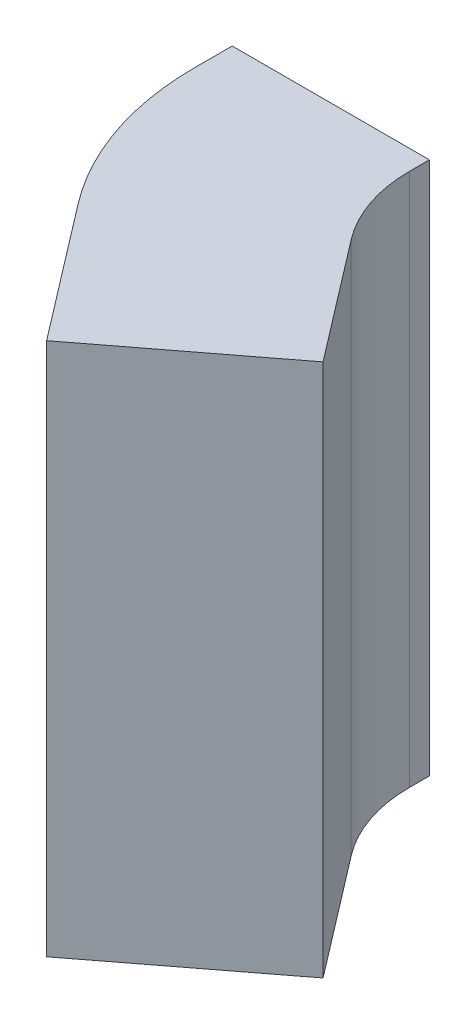
ISO-10303-21;
HEADER;
FILE_DESCRIPTION(('STEP AP214'),'2;1');
FILE_NAME('part.step','',(''),(''),'','','');
FILE_SCHEMA(('AUTOMOTIVE_DESIGN { 1 0 10303 214 1 1 1 1 }'));
ENDSEC;
DATA;
#1=APPLICATION_CONTEXT('core data for automotive mechanical design processes');
#2=APPLICATION_PROTOCOL_DEFINITION('international standard','automotive_design',2000,#1);
#3=PRODUCT_CONTEXT('',#1,'mechanical');
#4=PRODUCT('Part','Part','',(#3));
#5=PRODUCT_RELATED_PRODUCT_CATEGORY('part','',(#4));
#6=PRODUCT_DEFINITION_FORMATION('','',#4);
#7=PRODUCT_DEFINITION_CONTEXT('part definition',#1,'design');
#8=PRODUCT_DEFINITION('design','',#6,#7);
#9=PRODUCT_DEFINITION_SHAPE('','',#8);
#10=(LENGTH_UNIT() NAMED_UNIT(*) SI_UNIT(.MILLI.,.METRE.));
#11=(NAMED_UNIT(*) PLANE_ANGLE_UNIT() SI_UNIT($,.RADIAN.));
#12=(NAMED_UNIT(*) SI_UNIT($,.STERADIAN.) SOLID_ANGLE_UNIT());
#13=UNCERTAINTY_MEASURE_WITH_UNIT(LENGTH_MEASURE(1.E-05),#10,'distance_accuracy_value','');
#14=(GEOMETRIC_REPRESENTATION_CONTEXT(3) GLOBAL_UNCERTAINTY_ASSIGNED_CONTEXT((#13)) GLOBAL_UNIT_ASSIGNED_CONTEXT((#10,
#11,#12)) REPRESENTATION_CONTEXT('',''));
#15=CARTESIAN_POINT('',(0.,0.,0.));
#16=DIRECTION('',(0.,0.,1.));
#17=DIRECTION('',(1.,0.,0.));
#18=AXIS2_PLACEMENT_3D('',#15,#16,#17);
#19=CARTESIAN_POINT('',(3.45,-0.06,2.56476908614362));
#20=DIRECTION('',(-1.,0.,0.));
#21=DIRECTION('',(0.,0.,1.));
#22=AXIS2_PLACEMENT_3D('',#19,#20,#21);
#23=PLANE('',#22);
#24=DIRECTION('',(0.,0.,1.));
#25=VECTOR('',#24,1.);
#26=CARTESIAN_POINT('',(3.45,-0.06,2.56476908614362));
#27=LINE('',#26,#25);
#28=CARTESIAN_POINT('',(3.45,-0.06,2.5));
#29=VERTEX_POINT('',#28);
#30=CARTESIAN_POINT('',(3.45,-0.06,2.56476908614362));
#31=VERTEX_POINT('',#30);
#32=EDGE_CURVE('E85',#29,#31,#27,.T.);
#33=ORIENTED_EDGE('',*,*,#32,.T.);
#34=DIRECTION('',(0.,1.,0.));
#35=VECTOR('',#34,1.);
#36=CARTESIAN_POINT('',(3.45,-0.06,2.56476908614362));
#37=LINE('',#36,#35);
#38=CARTESIAN_POINT('',(3.45,0.86,2.56476908614362));
#39=VERTEX_POINT('',#38);
#40=EDGE_CURVE('E79',#39,#31,#37,.F.);
#41=ORIENTED_EDGE('',*,*,#40,.F.);
#42=DIRECTION('',(0.,0.,1.));
#43=VECTOR('',#42,1.);
#44=CARTESIAN_POINT('',(3.45,0.86,2.56476908614362));
#45=LINE('',#44,#43);
#46=CARTESIAN_POINT('',(3.45,0.86,2.5));
#47=VERTEX_POINT('',#46);
#48=EDGE_CURVE('E82',#47,#39,#45,.T.);
#49=ORIENTED_EDGE('',*,*,#48,.F.);
#50=DIRECTION('',(0.,1.,0.));
#51=VECTOR('',#50,1.);
#52=CARTESIAN_POINT('',(3.45,-0.06,2.5));
#53=LINE('',#52,#51);
#54=EDGE_CURVE('E138',#29,#47,#53,.T.);
#55=ORIENTED_EDGE('',*,*,#54,.F.);
#56=EDGE_LOOP('',(#33,#41,#49,#55));
#57=FACE_BOUND('',#56,.T.);
#58=ADVANCED_FACE('F17',(#57),#23,.T.);
#59=CARTESIAN_POINT('',(3.95,-0.06,2.56476908614362));
#60=DIRECTION('',(0.,1.,0.));
#61=DIRECTION('',(0.,0.,1.));
#62=AXIS2_PLACEMENT_3D('',#59,#60,#61);
#63=CYLINDRICAL_SURFACE('',#62,0.5);
#64=CARTESIAN_POINT('',(3.95,-0.06,2.56476908614362));
#65=DIRECTION('',(0.,1.,0.));
#66=DIRECTION('',(0.,0.,1.));
#67=AXIS2_PLACEMENT_3D('',#64,#65,#66);
#68=CIRCLE('',#67,0.5);
#69=CARTESIAN_POINT('',(3.55294117647059,-0.06,2.86865112025791));
#70=VERTEX_POINT('',#69);
#71=EDGE_CURVE('E166',#31,#70,#68,.T.);
#72=ORIENTED_EDGE('',*,*,#71,.T.);
#73=DIRECTION('',(0.,1.,0.));
#74=VECTOR('',#73,1.);
#75=CARTESIAN_POINT('',(3.55294117647059,-0.06,2.86865112025791));
#76=LINE('',#75,#74);
#77=CARTESIAN_POINT('',(3.55294117647059,0.86,2.86865112025791));
#78=VERTEX_POINT('',#77);
#79=EDGE_CURVE('E94',#78,#70,#76,.F.);
#80=ORIENTED_EDGE('',*,*,#79,.F.);
#81=CARTESIAN_POINT('',(3.95,0.86,2.56476908614362));
#82=DIRECTION('',(0.,1.,0.));
#83=DIRECTION('',(0.,0.,1.));
#84=AXIS2_PLACEMENT_3D('',#81,#82,#83);
#85=CIRCLE('',#84,0.5);
#86=EDGE_CURVE('E20',#39,#78,#85,.T.);
#87=ORIENTED_EDGE('',*,*,#86,.F.);
#88=ORIENTED_EDGE('',*,*,#40,.T.);
#89=EDGE_LOOP('',(#72,#80,#87,#88));
#90=FACE_BOUND('',#89,.T.);
#91=ADVANCED_FACE('F92',(#90),#63,.T.);
#92=CARTESIAN_POINT('',(3.79,-0.06,2.5));
#93=DIRECTION('',(1.,0.,0.));
#94=DIRECTION('',(0.,0.,-1.));
#95=AXIS2_PLACEMENT_3D('',#92,#93,#94);
#96=PLANE('',#95);
#97=DIRECTION('',(0.,0.,1.));
#98=VECTOR('',#97,1.);
#99=CARTESIAN_POINT('',(3.79,-0.06,2.56476908614362));
#100=LINE('',#99,#98);
#101=CARTESIAN_POINT('',(3.79,-0.06,2.53428124927838));
#102=VERTEX_POINT('',#101);
#103=CARTESIAN_POINT('',(3.79,-0.06,2.5));
#104=VERTEX_POINT('',#103);
#105=EDGE_CURVE('E143',#102,#104,#100,.F.);
#106=ORIENTED_EDGE('',*,*,#105,.T.);
#107=DIRECTION('',(0.,1.,0.));
#108=VECTOR('',#107,1.);
#109=CARTESIAN_POINT('',(3.79,-0.06,2.5));
#110=LINE('',#109,#108);
#111=CARTESIAN_POINT('',(3.79,0.86,2.5));
#112=VERTEX_POINT('',#111);
#113=EDGE_CURVE('E88',#112,#104,#110,.F.);
#114=ORIENTED_EDGE('',*,*,#113,.F.);
#115=DIRECTION('',(0.,0.,1.));
#116=VECTOR('',#115,1.);
#117=CARTESIAN_POINT('',(3.79,0.86,2.56476908614362));
#118=LINE('',#117,#116);
#119=CARTESIAN_POINT('',(3.79,0.86,2.53428124927838));
#120=VERTEX_POINT('',#119);
#121=EDGE_CURVE('E157',#120,#112,#118,.F.);
#122=ORIENTED_EDGE('',*,*,#121,.F.);
#123=DIRECTION('',(0.,1.,0.));
#124=VECTOR('',#123,1.);
#125=CARTESIAN_POINT('',(3.79,-0.06,2.53428124927838));
#126=LINE('',#125,#124);
#127=EDGE_CURVE('E104',#120,#102,#126,.F.);
#128=ORIENTED_EDGE('',*,*,#127,.T.);
#129=EDGE_LOOP('',(#106,#114,#122,#128));
#130=FACE_BOUND('',#129,.T.);
#131=ADVANCED_FACE('F180',(#130),#96,.T.);
#132=CARTESIAN_POINT('',(3.79,-0.06,2.5));
#133=DIRECTION('',(0.,0.,-1.));
#134=DIRECTION('',(-1.,0.,0.));
#135=AXIS2_PLACEMENT_3D('',#132,#133,#134);
#136=PLANE('',#135);
#137=DIRECTION('',(1.,0.,0.));
#138=VECTOR('',#137,1.);
#139=CARTESIAN_POINT('',(3.95,-0.06,2.5));
#140=LINE('',#139,#138);
#141=EDGE_CURVE('E129',#104,#29,#140,.F.);
#142=ORIENTED_EDGE('',*,*,#141,.T.);
#143=ORIENTED_EDGE('',*,*,#54,.T.);
#144=DIRECTION('',(1.,0.,0.));
#145=VECTOR('',#144,1.);
#146=CARTESIAN_POINT('',(3.95,0.86,2.5));
#147=LINE('',#146,#145);
#148=EDGE_CURVE('E102',#112,#47,#147,.F.);
#149=ORIENTED_EDGE('',*,*,#148,.F.);
#150=ORIENTED_EDGE('',*,*,#113,.T.);
#151=EDGE_LOOP('',(#142,#143,#149,#150));
#152=FACE_BOUND('',#151,.T.);
#153=ADVANCED_FACE('F183',(#152),#136,.T.);
#154=CARTESIAN_POINT('',(4.04,-0.06,2.53428124927838));
#155=DIRECTION('',(0.,1.,0.));
#156=DIRECTION('',(0.,0.,1.));
#157=AXIS2_PLACEMENT_3D('',#154,#155,#156);
#158=CYLINDRICAL_SURFACE('',#157,0.25);
#159=DIRECTION('',(0.,1.,0.));
#160=VECTOR('',#159,1.);
#161=CARTESIAN_POINT('',(3.8414705882353,-0.06,2.68622226633553));
#162=LINE('',#161,#160);
#163=CARTESIAN_POINT('',(3.8414705882353,-0.06,2.68622226633553));
#164=VERTEX_POINT('',#163);
#165=CARTESIAN_POINT('',(3.8414705882353,0.86,2.68622226633553));
#166=VERTEX_POINT('',#165);
#167=EDGE_CURVE('E112',#164,#166,#162,.T.);
#168=ORIENTED_EDGE('',*,*,#167,.F.);
#169=CARTESIAN_POINT('',(4.04,-0.06,2.53428124927838));
#170=DIRECTION('',(0.,1.,0.));
#171=DIRECTION('',(0.,0.,1.));
#172=AXIS2_PLACEMENT_3D('',#169,#170,#171);
#173=CIRCLE('',#172,0.25);
#174=EDGE_CURVE('E162',#164,#102,#173,.F.);
#175=ORIENTED_EDGE('',*,*,#174,.T.);
#176=ORIENTED_EDGE('',*,*,#127,.F.);
#177=CARTESIAN_POINT('',(4.04,0.86,2.53428124927838));
#178=DIRECTION('',(0.,1.,0.));
#179=DIRECTION('',(0.,0.,1.));
#180=AXIS2_PLACEMENT_3D('',#177,#178,#179);
#181=CIRCLE('',#180,0.25);
#182=EDGE_CURVE('E97',#166,#120,#181,.F.);
#183=ORIENTED_EDGE('',*,*,#182,.F.);
#184=EDGE_LOOP('',(#168,#175,#176,#183));
#185=FACE_BOUND('',#184,.T.);
#186=ADVANCED_FACE('F208',(#185),#158,.F.);
#187=CARTESIAN_POINT('',(3.95,0.86,2.56476908614362));
#188=DIRECTION('',(0.,1.,0.));
#189=DIRECTION('',(0.,0.,1.));
#190=AXIS2_PLACEMENT_3D('',#187,#188,#189);
#191=PLANE('',#190);
#192=ORIENTED_EDGE('',*,*,#182,.T.);
#193=ORIENTED_EDGE('',*,*,#121,.T.);
#194=ORIENTED_EDGE('',*,*,#148,.T.);
#195=ORIENTED_EDGE('',*,*,#48,.T.);
#196=ORIENTED_EDGE('',*,*,#86,.T.);
#197=DIRECTION('',(0.607764068228584,0.,0.794117647058823));
#198=VECTOR('',#197,1.);
#199=CARTESIAN_POINT('',(3.73,0.86,3.1));
#200=LINE('',#199,#198);
#201=CARTESIAN_POINT('',(3.73,0.86,3.1));
#202=VERTEX_POINT('',#201);
#203=EDGE_CURVE('E148',#202,#78,#200,.F.);
#204=ORIENTED_EDGE('',*,*,#203,.F.);
#205=DIRECTION('',(0.794117647058823,0.,-0.607764068228584));
#206=VECTOR('',#205,1.);
#207=CARTESIAN_POINT('',(4.,0.86,2.89336021680228));
#208=LINE('',#207,#206);
#209=CARTESIAN_POINT('',(4.,0.86,2.89336021680228));
#210=VERTEX_POINT('',#209);
#211=EDGE_CURVE('E115',#210,#202,#208,.F.);
#212=ORIENTED_EDGE('',*,*,#211,.F.);
#213=DIRECTION('',(-0.607764068228584,0.,-0.794117647058823));
#214=VECTOR('',#213,1.);
#215=CARTESIAN_POINT('',(3.8414705882353,0.86,2.68622226633553));
#216=LINE('',#215,#214);
#217=EDGE_CURVE('E117',#166,#210,#216,.F.);
#218=ORIENTED_EDGE('',*,*,#217,.F.);
#219=EDGE_LOOP('',(#192,#193,#194,#195,#196,#204,#212,#218));
#220=FACE_BOUND('',#219,.T.);
#221=ADVANCED_FACE('F99',(#220),#191,.T.);
#222=CARTESIAN_POINT('',(3.73,-0.06,3.1));
#223=DIRECTION('',(-0.794117647058823,0.,0.607764068228584));
#224=DIRECTION('',(0.607764068228584,0.,0.794117647058823));
#225=AXIS2_PLACEMENT_3D('',#222,#223,#224);
#226=PLANE('',#225);
#227=DIRECTION('',(0.607764068228586,0.,0.794117647058822));
#228=VECTOR('',#227,1.);
#229=CARTESIAN_POINT('',(3.55294117647059,-0.06,2.86865112025791));
#230=LINE('',#229,#228);
#231=CARTESIAN_POINT('',(3.73,-0.06,3.1));
#232=VERTEX_POINT('',#231);
#233=EDGE_CURVE('E165',#70,#232,#230,.T.);
#234=ORIENTED_EDGE('',*,*,#233,.T.);
#235=DIRECTION('',(0.,1.,0.));
#236=VECTOR('',#235,1.);
#237=CARTESIAN_POINT('',(3.73,-0.06,3.1));
#238=LINE('',#237,#236);
#239=EDGE_CURVE('E124',#202,#232,#238,.F.);
#240=ORIENTED_EDGE('',*,*,#239,.F.);
#241=ORIENTED_EDGE('',*,*,#203,.T.);
#242=ORIENTED_EDGE('',*,*,#79,.T.);
#243=EDGE_LOOP('',(#234,#240,#241,#242));
#244=FACE_BOUND('',#243,.T.);
#245=ADVANCED_FACE('F187',(#244),#226,.T.);
#246=CARTESIAN_POINT('',(3.95,-0.06,2.56476908614362));
#247=DIRECTION('',(0.,1.,0.));
#248=DIRECTION('',(0.,0.,1.));
#249=AXIS2_PLACEMENT_3D('',#246,#247,#248);
#250=PLANE('',#249);
#251=ORIENTED_EDGE('',*,*,#105,.F.);
#252=ORIENTED_EDGE('',*,*,#174,.F.);
#253=DIRECTION('',(-0.607764068228584,0.,-0.794117647058823));
#254=VECTOR('',#253,1.);
#255=CARTESIAN_POINT('',(3.8414705882353,-0.06,2.68622226633553));
#256=LINE('',#255,#254);
#257=CARTESIAN_POINT('',(4.,-0.06,2.89336021680228));
#258=VERTEX_POINT('',#257);
#259=EDGE_CURVE('E35',#258,#164,#256,.T.);
#260=ORIENTED_EDGE('',*,*,#259,.F.);
#261=DIRECTION('',(0.794117647058823,0.,-0.607764068228584));
#262=VECTOR('',#261,1.);
#263=CARTESIAN_POINT('',(4.,-0.06,2.89336021680228));
#264=LINE('',#263,#262);
#265=EDGE_CURVE('E26',#232,#258,#264,.T.);
#266=ORIENTED_EDGE('',*,*,#265,.F.);
#267=ORIENTED_EDGE('',*,*,#233,.F.);
#268=ORIENTED_EDGE('',*,*,#71,.F.);
#269=ORIENTED_EDGE('',*,*,#32,.F.);
#270=ORIENTED_EDGE('',*,*,#141,.F.);
#271=EDGE_LOOP('',(#251,#252,#260,#266,#267,#268,#269,#270));
#272=FACE_BOUND('',#271,.T.);
#273=ADVANCED_FACE('F184',(#272),#250,.F.);
#274=CARTESIAN_POINT('',(3.8414705882353,-0.06,2.68622226633553));
#275=DIRECTION('',(0.794117647058823,0.,-0.607764068228584));
#276=DIRECTION('',(-0.607764068228584,0.,-0.794117647058823));
#277=AXIS2_PLACEMENT_3D('',#274,#275,#276);
#278=PLANE('',#277);
#279=ORIENTED_EDGE('',*,*,#259,.T.);
#280=ORIENTED_EDGE('',*,*,#167,.T.);
#281=ORIENTED_EDGE('',*,*,#217,.T.);
#282=DIRECTION('',(0.,1.,0.));
#283=VECTOR('',#282,1.);
#284=CARTESIAN_POINT('',(4.,-0.06,2.89336021680228));
#285=LINE('',#284,#283);
#286=EDGE_CURVE('E11',#258,#210,#285,.T.);
#287=ORIENTED_EDGE('',*,*,#286,.F.);
#288=EDGE_LOOP('',(#279,#280,#281,#287));
#289=FACE_BOUND('',#288,.T.);
#290=ADVANCED_FACE('F191',(#289),#278,.T.);
#291=CARTESIAN_POINT('',(4.,-0.06,2.89336021680228));
#292=DIRECTION('',(0.607764068228584,0.,0.794117647058823));
#293=DIRECTION('',(0.794117647058823,0.,-0.607764068228584));
#294=AXIS2_PLACEMENT_3D('',#291,#292,#293);
#295=PLANE('',#294);
#296=ORIENTED_EDGE('',*,*,#265,.T.);
#297=ORIENTED_EDGE('',*,*,#286,.T.);
#298=ORIENTED_EDGE('',*,*,#211,.T.);
#299=ORIENTED_EDGE('',*,*,#239,.T.);
#300=EDGE_LOOP('',(#296,#297,#298,#299));
#301=FACE_BOUND('',#300,.T.);
#302=ADVANCED_FACE('F193',(#301),#295,.T.);
#303=CLOSED_SHELL('',(#58,#91,#131,#153,#186,#221,#245,#273,#290,#302));
#304=MANIFOLD_SOLID_BREP('B1',#303);
#305=ADVANCED_BREP_SHAPE_REPRESENTATION('',(#18,#304),#14);
#306=SHAPE_DEFINITION_REPRESENTATION(#9,#305);
ENDSEC;
END-ISO-10303-21;
